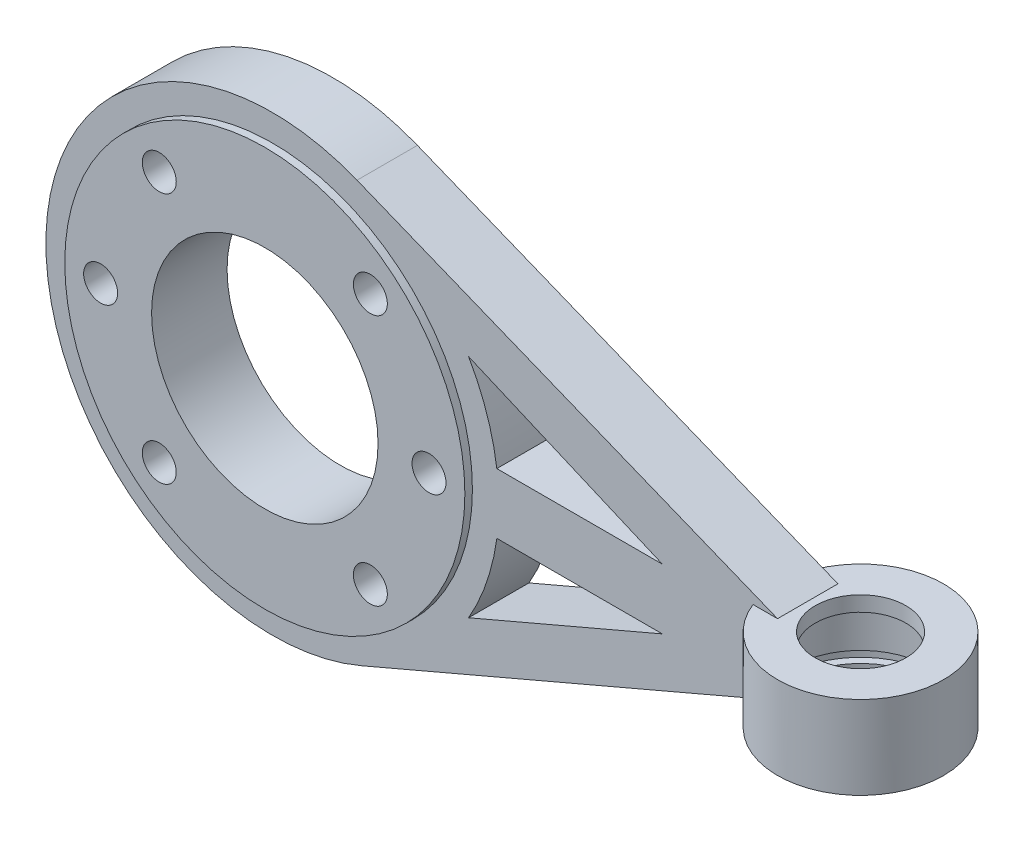
ISO-10303-21;
HEADER;
FILE_DESCRIPTION(('STEP AP214'),'2;1');
FILE_NAME('part.step','',(''),(''),'','','');
FILE_SCHEMA(('AUTOMOTIVE_DESIGN { 1 0 10303 214 1 1 1 1 }'));
ENDSEC;
DATA;
#1=APPLICATION_CONTEXT('core data for automotive mechanical design processes');
#2=APPLICATION_PROTOCOL_DEFINITION('international standard','automotive_design',2000,#1);
#3=PRODUCT_CONTEXT('',#1,'mechanical');
#4=PRODUCT('Part','Part','',(#3));
#5=PRODUCT_RELATED_PRODUCT_CATEGORY('part','',(#4));
#6=PRODUCT_DEFINITION_FORMATION('','',#4);
#7=PRODUCT_DEFINITION_CONTEXT('part definition',#1,'design');
#8=PRODUCT_DEFINITION('design','',#6,#7);
#9=PRODUCT_DEFINITION_SHAPE('','',#8);
#10=(LENGTH_UNIT() NAMED_UNIT(*) SI_UNIT(.MILLI.,.METRE.));
#11=(NAMED_UNIT(*) PLANE_ANGLE_UNIT() SI_UNIT($,.RADIAN.));
#12=(NAMED_UNIT(*) SI_UNIT($,.STERADIAN.) SOLID_ANGLE_UNIT());
#13=UNCERTAINTY_MEASURE_WITH_UNIT(LENGTH_MEASURE(1.E-05),#10,'distance_accuracy_value','');
#14=(GEOMETRIC_REPRESENTATION_CONTEXT(3) GLOBAL_UNCERTAINTY_ASSIGNED_CONTEXT((#13)) GLOBAL_UNIT_ASSIGNED_CONTEXT((#10,
#11,#12)) REPRESENTATION_CONTEXT('',''));
#15=CARTESIAN_POINT('',(0.,0.,0.));
#16=DIRECTION('',(0.,0.,1.));
#17=DIRECTION('',(1.,0.,0.));
#18=AXIS2_PLACEMENT_3D('',#15,#16,#17);
#19=CARTESIAN_POINT('',(73.9156216453703,30.8308441227157,3.));
#20=DIRECTION('',(0.,-1.,0.));
#21=DIRECTION('',(0.,0.,-1.));
#22=AXIS2_PLACEMENT_3D('',#19,#20,#21);
#23=CYLINDRICAL_SURFACE('',#22,9.);
#24=CARTESIAN_POINT('',(73.9156216453703,3.375,3.));
#25=DIRECTION('',(0.,1.,0.));
#26=DIRECTION('',(-1.,0.,0.));
#27=AXIS2_PLACEMENT_3D('',#24,#25,#26);
#28=CIRCLE('',#27,9.);
#29=CARTESIAN_POINT('',(64.9156216453703,3.375,3.));
#30=VERTEX_POINT('',#29);
#31=EDGE_CURVE('E181',#30,#30,#28,.F.);
#32=ORIENTED_EDGE('',*,*,#31,.F.);
#33=EDGE_LOOP('',(#32));
#34=FACE_BOUND('',#33,.T.);
#35=CARTESIAN_POINT('',(73.9156216453703,-3.12500000000002,3.));
#36=DIRECTION('',(0.,-1.,0.));
#37=DIRECTION('',(0.,0.,-1.));
#38=AXIS2_PLACEMENT_3D('',#35,#36,#37);
#39=CIRCLE('',#38,9.);
#40=CARTESIAN_POINT('',(73.9156216453703,-3.12500000000002,-6.));
#41=VERTEX_POINT('',#40);
#42=EDGE_CURVE('E166',#41,#41,#39,.T.);
#43=ORIENTED_EDGE('',*,*,#42,.T.);
#44=EDGE_LOOP('',(#43));
#45=FACE_BOUND('',#44,.T.);
#46=ADVANCED_FACE('F37',(#34,#45),#23,.F.);
#47=CARTESIAN_POINT('',(11.2147311143225,27.824985283616,7.));
#48=DIRECTION('',(-0.373824370477416,-0.927499509453867,0.));
#49=DIRECTION('',(0.927499509453867,-0.373824370477416,0.));
#50=AXIS2_PLACEMENT_3D('',#47,#48,#49);
#51=PLANE('',#50);
#52=DIRECTION('',(-0.927499509453867,0.373824370477416,0.));
#53=VECTOR('',#52,1.);
#54=CARTESIAN_POINT('',(11.2147311143225,27.824985283616,-1.));
#55=LINE('',#54,#53);
#56=CARTESIAN_POINT('',(66.9156216453703,5.375,-1.));
#57=VERTEX_POINT('',#56);
#58=CARTESIAN_POINT('',(11.2147311143225,27.824985283616,-1.));
#59=VERTEX_POINT('',#58);
#60=EDGE_CURVE('E200',#57,#59,#55,.T.);
#61=ORIENTED_EDGE('',*,*,#60,.T.);
#62=DIRECTION('',(0.,0.,-1.));
#63=VECTOR('',#62,1.);
#64=CARTESIAN_POINT('',(11.2147311143225,27.824985283616,7.));
#65=LINE('',#64,#63);
#66=CARTESIAN_POINT('',(11.2147311143225,27.824985283616,7.));
#67=VERTEX_POINT('',#66);
#68=EDGE_CURVE('E219',#67,#59,#65,.T.);
#69=ORIENTED_EDGE('',*,*,#68,.F.);
#70=DIRECTION('',(-0.927499509453867,0.373824370477416,0.));
#71=VECTOR('',#70,1.);
#72=CARTESIAN_POINT('',(11.2147311143225,27.824985283616,7.));
#73=LINE('',#72,#71);
#74=CARTESIAN_POINT('',(66.9156216453703,5.375,7.));
#75=VERTEX_POINT('',#74);
#76=EDGE_CURVE('E201',#75,#67,#73,.T.);
#77=ORIENTED_EDGE('',*,*,#76,.F.);
#78=DIRECTION('',(0.,0.,-1.));
#79=VECTOR('',#78,1.);
#80=CARTESIAN_POINT('',(66.9156216453703,5.375,7.));
#81=LINE('',#80,#79);
#82=EDGE_CURVE('E221',#75,#57,#81,.T.);
#83=ORIENTED_EDGE('',*,*,#82,.T.);
#84=EDGE_LOOP('',(#61,#69,#77,#83));
#85=FACE_BOUND('',#84,.T.);
#86=ADVANCED_FACE('F303',(#85),#51,.F.);
#87=CARTESIAN_POINT('',(11.8010452100285,-27.581430926456,7.));
#88=DIRECTION('',(-0.393368173667616,0.919381030881867,0.));
#89=DIRECTION('',(-0.919381030881867,-0.393368173667616,0.));
#90=AXIS2_PLACEMENT_3D('',#87,#88,#89);
#91=PLANE('',#90);
#92=DIRECTION('',(0.,0.,1.));
#93=VECTOR('',#92,1.);
#94=CARTESIAN_POINT('',(63.1176677813004,-5.62500000000001,7.));
#95=LINE('',#94,#93);
#96=CARTESIAN_POINT('',(63.1176677813004,-5.625,0.90138322950138));
#97=VERTEX_POINT('',#96);
#98=CARTESIAN_POINT('',(63.1176677813004,-5.625,5.09861677049862));
#99=VERTEX_POINT('',#98);
#100=EDGE_CURVE('E230',#97,#99,#95,.T.);
#101=ORIENTED_EDGE('',*,*,#100,.T.);
#102=CARTESIAN_POINT('',(73.9156216453703,-1.00496625100902,3.));
#103=DIRECTION('',(-0.393368173667616,0.919381030881867,0.));
#104=DIRECTION('',(0.919381030881867,0.393368173667616,0.));
#105=AXIS2_PLACEMENT_3D('',#102,#103,#104);
#106=ELLIPSE('',#105,11.9645714132788,11.);
#107=CARTESIAN_POINT('',(63.6686708794107,-5.38924673219444,7.));
#108=VERTEX_POINT('',#107);
#109=EDGE_CURVE('E196',#99,#108,#106,.T.);
#110=ORIENTED_EDGE('',*,*,#109,.T.);
#111=DIRECTION('',(0.919381030881867,0.393368173667616,0.));
#112=VECTOR('',#111,1.);
#113=CARTESIAN_POINT('',(11.8010452100285,-27.581430926456,7.));
#114=LINE('',#113,#112);
#115=CARTESIAN_POINT('',(11.8010452100285,-27.581430926456,7.));
#116=VERTEX_POINT('',#115);
#117=EDGE_CURVE('E207',#116,#108,#114,.T.);
#118=ORIENTED_EDGE('',*,*,#117,.F.);
#119=DIRECTION('',(0.,0.,-1.));
#120=VECTOR('',#119,1.);
#121=CARTESIAN_POINT('',(11.8010452100285,-27.581430926456,7.));
#122=LINE('',#121,#120);
#123=CARTESIAN_POINT('',(11.8010452100285,-27.581430926456,-1.));
#124=VERTEX_POINT('',#123);
#125=EDGE_CURVE('E210',#116,#124,#122,.T.);
#126=ORIENTED_EDGE('',*,*,#125,.T.);
#127=DIRECTION('',(0.919381030881867,0.393368173667616,0.));
#128=VECTOR('',#127,1.);
#129=CARTESIAN_POINT('',(11.8010452100285,-27.581430926456,-1.));
#130=LINE('',#129,#128);
#131=CARTESIAN_POINT('',(63.6686708794107,-5.38924673219444,-1.));
#132=VERTEX_POINT('',#131);
#133=EDGE_CURVE('E205',#124,#132,#130,.T.);
#134=ORIENTED_EDGE('',*,*,#133,.T.);
#135=EDGE_CURVE('E192',#132,#97,#106,.T.);
#136=ORIENTED_EDGE('',*,*,#135,.T.);
#137=EDGE_LOOP('',(#101,#110,#118,#126,#134,#136));
#138=FACE_BOUND('',#137,.T.);
#139=ADVANCED_FACE('F317',(#138),#91,.F.);
#140=CARTESIAN_POINT('',(0.,0.,7.));
#141=DIRECTION('',(0.,0.,1.));
#142=DIRECTION('',(1.,0.,0.));
#143=AXIS2_PLACEMENT_3D('',#140,#141,#142);
#144=PLANE('',#143);
#145=CARTESIAN_POINT('',(0.,0.,7.));
#146=DIRECTION('',(0.,0.,1.));
#147=DIRECTION('',(1.,0.,0.));
#148=AXIS2_PLACEMENT_3D('',#145,#146,#147);
#149=CIRCLE('',#148,30.);
#150=CARTESIAN_POINT('',(29.732137494637,-4.,7.));
#151=VERTEX_POINT('',#150);
#152=CARTESIAN_POINT('',(25.9896947238964,-14.9845176151477,7.));
#153=VERTEX_POINT('',#152);
#154=EDGE_CURVE('E155',#151,#153,#149,.F.);
#155=ORIENTED_EDGE('',*,*,#154,.F.);
#156=DIRECTION('',(-1.,0.,0.));
#157=VECTOR('',#156,1.);
#158=CARTESIAN_POINT('',(0.,-4.,7.));
#159=LINE('',#158,#157);
#160=CARTESIAN_POINT('',(51.6627354139849,-4.,7.));
#161=VERTEX_POINT('',#160);
#162=EDGE_CURVE('E153',#161,#151,#159,.T.);
#163=ORIENTED_EDGE('',*,*,#162,.F.);
#164=DIRECTION('',(0.919381030881867,0.393368173667616,0.));
#165=VECTOR('',#164,1.);
#166=CARTESIAN_POINT('',(9.44083616802279,-22.0651447411648,7.));
#167=LINE('',#166,#165);
#168=EDGE_CURVE('E148',#153,#161,#167,.T.);
#169=ORIENTED_EDGE('',*,*,#168,.F.);
#170=EDGE_LOOP('',(#155,#163,#169));
#171=FACE_BOUND('',#170,.T.);
#172=CARTESIAN_POINT('',(0.,0.,7.));
#173=DIRECTION('',(0.,0.,1.));
#174=DIRECTION('',(1.,0.,0.));
#175=AXIS2_PLACEMENT_3D('',#172,#173,#174);
#176=CIRCLE('',#175,30.);
#177=CARTESIAN_POINT('',(25.9896947238964,14.9845176151477,7.));
#178=VERTEX_POINT('',#177);
#179=CARTESIAN_POINT('',(29.732137494637,4.,7.));
#180=VERTEX_POINT('',#179);
#181=EDGE_CURVE('E146',#178,#180,#176,.F.);
#182=ORIENTED_EDGE('',*,*,#181,.F.);
#183=DIRECTION('',(-0.919381030881867,0.393368173667616,0.));
#184=VECTOR('',#183,1.);
#185=CARTESIAN_POINT('',(9.44083616802279,22.0651447411648,7.));
#186=LINE('',#185,#184);
#187=CARTESIAN_POINT('',(51.6627354139849,4.,7.));
#188=VERTEX_POINT('',#187);
#189=EDGE_CURVE('E132',#188,#178,#186,.T.);
#190=ORIENTED_EDGE('',*,*,#189,.F.);
#191=DIRECTION('',(1.,0.,0.));
#192=VECTOR('',#191,1.);
#193=CARTESIAN_POINT('',(0.,4.,7.));
#194=LINE('',#193,#192);
#195=EDGE_CURVE('E124',#180,#188,#194,.T.);
#196=ORIENTED_EDGE('',*,*,#195,.F.);
#197=EDGE_LOOP('',(#182,#190,#196));
#198=FACE_BOUND('',#197,.T.);
#199=CARTESIAN_POINT('',(0.,0.,7.));
#200=DIRECTION('',(0.,0.,1.));
#201=DIRECTION('',(1.,0.,0.));
#202=AXIS2_PLACEMENT_3D('',#199,#200,#201);
#203=CIRCLE('',#202,26.5);
#204=CARTESIAN_POINT('',(26.5,0.,7.));
#205=VERTEX_POINT('',#204);
#206=EDGE_CURVE('E161',#205,#205,#203,.F.);
#207=ORIENTED_EDGE('',*,*,#206,.T.);
#208=EDGE_LOOP('',(#207));
#209=FACE_BOUND('',#208,.T.);
#210=DIRECTION('',(-1.,0.,0.));
#211=VECTOR('',#210,1.);
#212=CARTESIAN_POINT('',(0.,5.37499999999998,7.));
#213=LINE('',#212,#211);
#214=CARTESIAN_POINT('',(63.6686708794107,5.375,7.));
#215=VERTEX_POINT('',#214);
#216=EDGE_CURVE('E198',#75,#215,#213,.T.);
#217=ORIENTED_EDGE('',*,*,#216,.F.);
#218=ORIENTED_EDGE('',*,*,#76,.T.);
#219=CARTESIAN_POINT('',(0.,0.,7.));
#220=DIRECTION('',(0.,0.,1.));
#221=DIRECTION('',(1.,0.,0.));
#222=AXIS2_PLACEMENT_3D('',#219,#220,#221);
#223=CIRCLE('',#222,30.);
#224=EDGE_CURVE('E204',#67,#116,#223,.T.);
#225=ORIENTED_EDGE('',*,*,#224,.T.);
#226=ORIENTED_EDGE('',*,*,#117,.T.);
#227=DIRECTION('',(0.,1.,0.));
#228=VECTOR('',#227,1.);
#229=CARTESIAN_POINT('',(63.6686708794107,22.7172907254557,7.));
#230=LINE('',#229,#228);
#231=EDGE_CURVE('E195',#215,#108,#230,.F.);
#232=ORIENTED_EDGE('',*,*,#231,.F.);
#233=EDGE_LOOP('',(#217,#218,#225,#226,#232));
#234=FACE_BOUND('',#233,.T.);
#235=ADVANCED_FACE('F144',(#171,#198,#209,#234),#144,.T.);
#236=CARTESIAN_POINT('',(0.,0.,-1.));
#237=DIRECTION('',(0.,0.,1.));
#238=DIRECTION('',(1.,0.,0.));
#239=AXIS2_PLACEMENT_3D('',#236,#237,#238);
#240=PLANE('',#239);
#241=DIRECTION('',(-1.,0.,0.));
#242=VECTOR('',#241,1.);
#243=CARTESIAN_POINT('',(0.,-4.,-1.));
#244=LINE('',#243,#242);
#245=CARTESIAN_POINT('',(51.6627354139849,-4.,-1.));
#246=VERTEX_POINT('',#245);
#247=CARTESIAN_POINT('',(29.732137494637,-4.,-1.));
#248=VERTEX_POINT('',#247);
#249=EDGE_CURVE('E45',#246,#248,#244,.T.);
#250=ORIENTED_EDGE('',*,*,#249,.T.);
#251=CARTESIAN_POINT('',(0.,0.,-1.));
#252=DIRECTION('',(0.,0.,1.));
#253=DIRECTION('',(1.,0.,0.));
#254=AXIS2_PLACEMENT_3D('',#251,#252,#253);
#255=CIRCLE('',#254,30.);
#256=CARTESIAN_POINT('',(25.9896947238964,-14.9845176151477,-1.));
#257=VERTEX_POINT('',#256);
#258=EDGE_CURVE('E12',#248,#257,#255,.F.);
#259=ORIENTED_EDGE('',*,*,#258,.T.);
#260=DIRECTION('',(0.919381030881867,0.393368173667616,0.));
#261=VECTOR('',#260,1.);
#262=CARTESIAN_POINT('',(9.44083616802279,-22.0651447411648,-1.));
#263=LINE('',#262,#261);
#264=EDGE_CURVE('E250',#257,#246,#263,.T.);
#265=ORIENTED_EDGE('',*,*,#264,.T.);
#266=EDGE_LOOP('',(#250,#259,#265));
#267=FACE_BOUND('',#266,.T.);
#268=DIRECTION('',(-0.919381030881867,0.393368173667616,0.));
#269=VECTOR('',#268,1.);
#270=CARTESIAN_POINT('',(9.44083616802279,22.0651447411648,-1.));
#271=LINE('',#270,#269);
#272=CARTESIAN_POINT('',(51.6627354139849,4.,-1.));
#273=VERTEX_POINT('',#272);
#274=CARTESIAN_POINT('',(25.9896947238964,14.9845176151477,-1.));
#275=VERTEX_POINT('',#274);
#276=EDGE_CURVE('E140',#273,#275,#271,.T.);
#277=ORIENTED_EDGE('',*,*,#276,.T.);
#278=CARTESIAN_POINT('',(0.,0.,-1.));
#279=DIRECTION('',(0.,0.,1.));
#280=DIRECTION('',(1.,0.,0.));
#281=AXIS2_PLACEMENT_3D('',#278,#279,#280);
#282=CIRCLE('',#281,30.);
#283=CARTESIAN_POINT('',(29.732137494637,4.,-1.));
#284=VERTEX_POINT('',#283);
#285=EDGE_CURVE('E247',#275,#284,#282,.F.);
#286=ORIENTED_EDGE('',*,*,#285,.T.);
#287=DIRECTION('',(1.,0.,0.));
#288=VECTOR('',#287,1.);
#289=CARTESIAN_POINT('',(0.,4.,-1.));
#290=LINE('',#289,#288);
#291=EDGE_CURVE('E240',#284,#273,#290,.T.);
#292=ORIENTED_EDGE('',*,*,#291,.T.);
#293=EDGE_LOOP('',(#277,#286,#292));
#294=FACE_BOUND('',#293,.T.);
#295=CARTESIAN_POINT('',(0.,0.,-1.));
#296=DIRECTION('',(0.,0.,1.));
#297=DIRECTION('',(1.,0.,0.));
#298=AXIS2_PLACEMENT_3D('',#295,#296,#297);
#299=CIRCLE('',#298,26.5);
#300=CARTESIAN_POINT('',(26.5,0.,-1.));
#301=VERTEX_POINT('',#300);
#302=EDGE_CURVE('E233',#301,#301,#299,.F.);
#303=ORIENTED_EDGE('',*,*,#302,.F.);
#304=EDGE_LOOP('',(#303));
#305=FACE_BOUND('',#304,.T.);
#306=ORIENTED_EDGE('',*,*,#60,.F.);
#307=DIRECTION('',(-1.,0.,0.));
#308=VECTOR('',#307,1.);
#309=CARTESIAN_POINT('',(0.,5.37499999999998,-1.));
#310=LINE('',#309,#308);
#311=CARTESIAN_POINT('',(63.6686708794107,5.375,-1.));
#312=VERTEX_POINT('',#311);
#313=EDGE_CURVE('E227',#57,#312,#310,.T.);
#314=ORIENTED_EDGE('',*,*,#313,.T.);
#315=DIRECTION('',(0.,1.,0.));
#316=VECTOR('',#315,1.);
#317=CARTESIAN_POINT('',(63.6686708794107,22.7172907254557,-1.));
#318=LINE('',#317,#316);
#319=EDGE_CURVE('E224',#312,#132,#318,.F.);
#320=ORIENTED_EDGE('',*,*,#319,.T.);
#321=ORIENTED_EDGE('',*,*,#133,.F.);
#322=CARTESIAN_POINT('',(0.,0.,-1.));
#323=DIRECTION('',(0.,0.,1.));
#324=DIRECTION('',(1.,0.,0.));
#325=AXIS2_PLACEMENT_3D('',#322,#323,#324);
#326=CIRCLE('',#325,30.);
#327=EDGE_CURVE('E213',#59,#124,#326,.T.);
#328=ORIENTED_EDGE('',*,*,#327,.F.);
#329=EDGE_LOOP('',(#306,#314,#320,#321,#328));
#330=FACE_BOUND('',#329,.T.);
#331=ADVANCED_FACE('F255',(#267,#294,#305,#330),#240,.F.);
#332=CARTESIAN_POINT('',(0.,0.,3.));
#333=DIRECTION('',(0.,0.,-1.));
#334=DIRECTION('',(-1.,0.,0.));
#335=AXIS2_PLACEMENT_3D('',#332,#333,#334);
#336=CYLINDRICAL_SURFACE('',#335,30.);
#337=ORIENTED_EDGE('',*,*,#327,.T.);
#338=ORIENTED_EDGE('',*,*,#125,.F.);
#339=ORIENTED_EDGE('',*,*,#224,.F.);
#340=ORIENTED_EDGE('',*,*,#68,.T.);
#341=EDGE_LOOP('',(#337,#338,#339,#340));
#342=FACE_BOUND('',#341,.T.);
#343=ADVANCED_FACE('F39',(#342),#336,.T.);
#344=CARTESIAN_POINT('',(62.9156216453703,-5.625,3.));
#345=DIRECTION('',(0.,-1.,0.));
#346=DIRECTION('',(1.,0.,0.));
#347=AXIS2_PLACEMENT_3D('',#344,#345,#346);
#348=PLANE('',#347);
#349=CARTESIAN_POINT('',(73.9156216453703,-5.62500000000002,3.));
#350=DIRECTION('',(0.,-1.,0.));
#351=DIRECTION('',(0.,0.,-1.));
#352=AXIS2_PLACEMENT_3D('',#349,#350,#351);
#353=CIRCLE('',#352,9.);
#354=CARTESIAN_POINT('',(73.9156216453703,-5.62500000000002,-6.));
#355=VERTEX_POINT('',#354);
#356=EDGE_CURVE('E174',#355,#355,#353,.T.);
#357=ORIENTED_EDGE('',*,*,#356,.F.);
#358=EDGE_LOOP('',(#357));
#359=FACE_BOUND('',#358,.T.);
#360=ORIENTED_EDGE('',*,*,#100,.F.);
#361=CARTESIAN_POINT('',(73.9156216453703,-5.625,3.));
#362=DIRECTION('',(0.,1.,0.));
#363=DIRECTION('',(-1.,0.,0.));
#364=AXIS2_PLACEMENT_3D('',#361,#362,#363);
#365=CIRCLE('',#364,11.);
#366=EDGE_CURVE('E185',#99,#97,#365,.T.);
#367=ORIENTED_EDGE('',*,*,#366,.F.);
#368=EDGE_LOOP('',(#360,#367));
#369=FACE_BOUND('',#368,.T.);
#370=ADVANCED_FACE('F319',(#359,#369),#348,.T.);
#371=CARTESIAN_POINT('',(73.9156216453703,22.7172907254557,3.));
#372=DIRECTION('',(0.,1.,0.));
#373=DIRECTION('',(-1.,0.,0.));
#374=AXIS2_PLACEMENT_3D('',#371,#372,#373);
#375=CYLINDRICAL_SURFACE('',#374,11.);
#376=ORIENTED_EDGE('',*,*,#109,.F.);
#377=ORIENTED_EDGE('',*,*,#366,.T.);
#378=ORIENTED_EDGE('',*,*,#135,.F.);
#379=ORIENTED_EDGE('',*,*,#319,.F.);
#380=CARTESIAN_POINT('',(73.9156216453703,5.375,3.));
#381=DIRECTION('',(0.,1.,0.));
#382=DIRECTION('',(-1.,0.,0.));
#383=AXIS2_PLACEMENT_3D('',#380,#381,#382);
#384=CIRCLE('',#383,11.);
#385=EDGE_CURVE('E188',#215,#312,#384,.T.);
#386=ORIENTED_EDGE('',*,*,#385,.F.);
#387=ORIENTED_EDGE('',*,*,#231,.T.);
#388=EDGE_LOOP('',(#376,#377,#378,#379,#386,#387));
#389=FACE_BOUND('',#388,.T.);
#390=ADVANCED_FACE('F314',(#389),#375,.T.);
#391=CARTESIAN_POINT('',(62.9156216453703,5.375,3.));
#392=DIRECTION('',(0.,1.,0.));
#393=DIRECTION('',(-1.,0.,0.));
#394=AXIS2_PLACEMENT_3D('',#391,#392,#393);
#395=PLANE('',#394);
#396=CARTESIAN_POINT('',(73.9156216453703,5.375,3.));
#397=DIRECTION('',(0.,1.,0.));
#398=DIRECTION('',(-1.,0.,0.));
#399=AXIS2_PLACEMENT_3D('',#396,#397,#398);
#400=CIRCLE('',#399,6.);
#401=CARTESIAN_POINT('',(67.9156216453703,5.375,3.));
#402=VERTEX_POINT('',#401);
#403=EDGE_CURVE('E189',#402,#402,#400,.T.);
#404=ORIENTED_EDGE('',*,*,#403,.F.);
#405=EDGE_LOOP('',(#404));
#406=FACE_BOUND('',#405,.T.);
#407=ORIENTED_EDGE('',*,*,#82,.F.);
#408=ORIENTED_EDGE('',*,*,#216,.T.);
#409=ORIENTED_EDGE('',*,*,#385,.T.);
#410=ORIENTED_EDGE('',*,*,#313,.F.);
#411=EDGE_LOOP('',(#407,#408,#409,#410));
#412=FACE_BOUND('',#411,.T.);
#413=ADVANCED_FACE('F306',(#406,#412),#395,.T.);
#414=CARTESIAN_POINT('',(73.9156216453703,19.375,3.));
#415=DIRECTION('',(0.,-1.,0.));
#416=DIRECTION('',(0.,0.,-1.));
#417=AXIS2_PLACEMENT_3D('',#414,#415,#416);
#418=CYLINDRICAL_SURFACE('',#417,6.);
#419=CARTESIAN_POINT('',(73.9156216453703,3.375,3.));
#420=DIRECTION('',(0.,1.,0.));
#421=DIRECTION('',(-1.,0.,0.));
#422=AXIS2_PLACEMENT_3D('',#419,#420,#421);
#423=CIRCLE('',#422,6.);
#424=CARTESIAN_POINT('',(67.9156216453703,3.375,3.));
#425=VERTEX_POINT('',#424);
#426=EDGE_CURVE('E184',#425,#425,#423,.F.);
#427=ORIENTED_EDGE('',*,*,#426,.T.);
#428=EDGE_LOOP('',(#427));
#429=FACE_BOUND('',#428,.T.);
#430=ORIENTED_EDGE('',*,*,#403,.T.);
#431=EDGE_LOOP('',(#430));
#432=FACE_BOUND('',#431,.T.);
#433=ADVANCED_FACE('F349',(#429,#432),#418,.F.);
#434=CARTESIAN_POINT('',(62.9156216453703,3.375,3.));
#435=DIRECTION('',(0.,1.,0.));
#436=DIRECTION('',(-1.,0.,0.));
#437=AXIS2_PLACEMENT_3D('',#434,#435,#436);
#438=PLANE('',#437);
#439=ORIENTED_EDGE('',*,*,#31,.T.);
#440=EDGE_LOOP('',(#439));
#441=FACE_BOUND('',#440,.T.);
#442=ORIENTED_EDGE('',*,*,#426,.F.);
#443=EDGE_LOOP('',(#442));
#444=FACE_BOUND('',#443,.T.);
#445=ADVANCED_FACE('F341',(#441,#444),#438,.F.);
#446=CARTESIAN_POINT('',(73.9156216453703,-4.62500000000002,3.));
#447=DIRECTION('',(0.,-1.,0.));
#448=DIRECTION('',(0.,0.,-1.));
#449=AXIS2_PLACEMENT_3D('',#446,#447,#448);
#450=CIRCLE('',#449,9.);
#451=CARTESIAN_POINT('',(73.9156216453703,-4.62500000000002,-6.));
#452=VERTEX_POINT('',#451);
#453=EDGE_CURVE('E167',#452,#452,#450,.T.);
#454=ORIENTED_EDGE('',*,*,#453,.F.);
#455=EDGE_LOOP('',(#454));
#456=FACE_BOUND('',#455,.T.);
#457=ORIENTED_EDGE('',*,*,#356,.T.);
#458=EDGE_LOOP('',(#457));
#459=FACE_BOUND('',#458,.T.);
#460=ADVANCED_FACE('F331',(#456,#459),#23,.F.);
#461=CARTESIAN_POINT('',(73.9156216453703,-4.62500000000002,3.));
#462=DIRECTION('',(0.,1.,0.));
#463=DIRECTION('',(0.,0.,1.));
#464=AXIS2_PLACEMENT_3D('',#461,#462,#463);
#465=CYLINDRICAL_SURFACE('',#464,9.99999999999999);
#466=CARTESIAN_POINT('',(73.9156216453703,-4.62500000000002,3.));
#467=DIRECTION('',(0.,-1.,0.));
#468=DIRECTION('',(0.,0.,-1.));
#469=AXIS2_PLACEMENT_3D('',#466,#467,#468);
#470=CIRCLE('',#469,9.99999999999999);
#471=CARTESIAN_POINT('',(73.9156216453703,-4.62500000000002,-6.99999999999999));
#472=VERTEX_POINT('',#471);
#473=EDGE_CURVE('E170',#472,#472,#470,.T.);
#474=ORIENTED_EDGE('',*,*,#473,.T.);
#475=EDGE_LOOP('',(#474));
#476=FACE_BOUND('',#475,.T.);
#477=CARTESIAN_POINT('',(73.9156216453703,-3.12500000000002,3.));
#478=DIRECTION('',(0.,-1.,0.));
#479=DIRECTION('',(0.,0.,-1.));
#480=AXIS2_PLACEMENT_3D('',#477,#478,#479);
#481=CIRCLE('',#480,9.99999999999999);
#482=CARTESIAN_POINT('',(73.9156216453703,-3.12500000000002,-6.99999999999999));
#483=VERTEX_POINT('',#482);
#484=EDGE_CURVE('E171',#483,#483,#481,.T.);
#485=ORIENTED_EDGE('',*,*,#484,.F.);
#486=EDGE_LOOP('',(#485));
#487=FACE_BOUND('',#486,.T.);
#488=ADVANCED_FACE('F340',(#476,#487),#465,.F.);
#489=CARTESIAN_POINT('',(0.,-4.62500000000002,0.));
#490=DIRECTION('',(0.,-1.,0.));
#491=DIRECTION('',(0.,0.,-1.));
#492=AXIS2_PLACEMENT_3D('',#489,#490,#491);
#493=PLANE('',#492);
#494=ORIENTED_EDGE('',*,*,#453,.T.);
#495=EDGE_LOOP('',(#494));
#496=FACE_BOUND('',#495,.T.);
#497=ORIENTED_EDGE('',*,*,#473,.F.);
#498=EDGE_LOOP('',(#497));
#499=FACE_BOUND('',#498,.T.);
#500=ADVANCED_FACE('F347',(#496,#499),#493,.F.);
#501=CARTESIAN_POINT('',(0.,-3.12500000000002,0.));
#502=DIRECTION('',(0.,-1.,0.));
#503=DIRECTION('',(0.,0.,-1.));
#504=AXIS2_PLACEMENT_3D('',#501,#502,#503);
#505=PLANE('',#504);
#506=ORIENTED_EDGE('',*,*,#42,.F.);
#507=EDGE_LOOP('',(#506));
#508=FACE_BOUND('',#507,.T.);
#509=ORIENTED_EDGE('',*,*,#484,.T.);
#510=EDGE_LOOP('',(#509));
#511=FACE_BOUND('',#510,.T.);
#512=ADVANCED_FACE('F284',(#508,#511),#505,.T.);
#513=CARTESIAN_POINT('',(0.,0.,-2.));
#514=DIRECTION('',(0.,0.,-1.));
#515=DIRECTION('',(-1.,0.,0.));
#516=AXIS2_PLACEMENT_3D('',#513,#514,#515);
#517=PLANE('',#516);
#518=CARTESIAN_POINT('',(21.75,0.,-2.));
#519=DIRECTION('',(0.,0.,-1.));
#520=DIRECTION('',(-1.,0.,0.));
#521=AXIS2_PLACEMENT_3D('',#518,#519,#520);
#522=CIRCLE('',#521,2.25);
#523=CARTESIAN_POINT('',(19.5,0.,-2.));
#524=VERTEX_POINT('',#523);
#525=EDGE_CURVE('E269',#524,#524,#522,.T.);
#526=ORIENTED_EDGE('',*,*,#525,.F.);
#527=EDGE_LOOP('',(#526));
#528=FACE_BOUND('',#527,.T.);
#529=CARTESIAN_POINT('',(-13.9806305106822,16.6614666378378,-2.));
#530=DIRECTION('',(0.,0.,-1.));
#531=DIRECTION('',(-1.,0.,0.));
#532=AXIS2_PLACEMENT_3D('',#529,#530,#531);
#533=CIRCLE('',#532,2.25);
#534=CARTESIAN_POINT('',(-16.2306305106822,16.6614666378378,-2.));
#535=VERTEX_POINT('',#534);
#536=EDGE_CURVE('E452',#535,#535,#533,.T.);
#537=ORIENTED_EDGE('',*,*,#536,.F.);
#538=EDGE_LOOP('',(#537));
#539=FACE_BOUND('',#538,.T.);
#540=CARTESIAN_POINT('',(13.9806305106822,-16.6614666378378,-2.));
#541=DIRECTION('',(0.,0.,-1.));
#542=DIRECTION('',(-1.,0.,0.));
#543=AXIS2_PLACEMENT_3D('',#540,#541,#542);
#544=CIRCLE('',#543,2.25);
#545=CARTESIAN_POINT('',(11.7306305106822,-16.6614666378378,-2.));
#546=VERTEX_POINT('',#545);
#547=EDGE_CURVE('E450',#546,#546,#544,.T.);
#548=ORIENTED_EDGE('',*,*,#547,.F.);
#549=EDGE_LOOP('',(#548));
#550=FACE_BOUND('',#549,.T.);
#551=CARTESIAN_POINT('',(-21.75,0.,-2.));
#552=DIRECTION('',(0.,0.,-1.));
#553=DIRECTION('',(-1.,0.,0.));
#554=AXIS2_PLACEMENT_3D('',#551,#552,#553);
#555=CIRCLE('',#554,2.25);
#556=CARTESIAN_POINT('',(-24.,0.,-2.));
#557=VERTEX_POINT('',#556);
#558=EDGE_CURVE('E447',#557,#557,#555,.T.);
#559=ORIENTED_EDGE('',*,*,#558,.F.);
#560=EDGE_LOOP('',(#559));
#561=FACE_BOUND('',#560,.T.);
#562=CARTESIAN_POINT('',(-13.9806305106822,-16.6614666378378,-2.));
#563=DIRECTION('',(0.,0.,-1.));
#564=DIRECTION('',(-1.,0.,0.));
#565=AXIS2_PLACEMENT_3D('',#562,#563,#564);
#566=CIRCLE('',#565,2.25);
#567=CARTESIAN_POINT('',(-16.2306305106822,-16.6614666378378,-2.));
#568=VERTEX_POINT('',#567);
#569=EDGE_CURVE('E428',#568,#568,#566,.T.);
#570=ORIENTED_EDGE('',*,*,#569,.F.);
#571=EDGE_LOOP('',(#570));
#572=FACE_BOUND('',#571,.T.);
#573=CARTESIAN_POINT('',(13.9806305106822,16.6614666378378,-2.));
#574=DIRECTION('',(0.,0.,-1.));
#575=DIRECTION('',(-1.,0.,0.));
#576=AXIS2_PLACEMENT_3D('',#573,#574,#575);
#577=CIRCLE('',#576,2.25);
#578=CARTESIAN_POINT('',(11.7306305106822,16.6614666378378,-2.));
#579=VERTEX_POINT('',#578);
#580=EDGE_CURVE('E424',#579,#579,#577,.T.);
#581=ORIENTED_EDGE('',*,*,#580,.F.);
#582=EDGE_LOOP('',(#581));
#583=FACE_BOUND('',#582,.T.);
#584=CARTESIAN_POINT('',(0.,0.,-2.));
#585=DIRECTION('',(0.,0.,-1.));
#586=DIRECTION('',(-1.,0.,0.));
#587=AXIS2_PLACEMENT_3D('',#584,#585,#586);
#588=CIRCLE('',#587,15.);
#589=CARTESIAN_POINT('',(-15.,0.,-2.));
#590=VERTEX_POINT('',#589);
#591=EDGE_CURVE('E133',#590,#590,#588,.T.);
#592=ORIENTED_EDGE('',*,*,#591,.F.);
#593=EDGE_LOOP('',(#592));
#594=FACE_BOUND('',#593,.T.);
#595=CARTESIAN_POINT('',(0.,0.,-2.));
#596=DIRECTION('',(0.,0.,-1.));
#597=DIRECTION('',(-1.,0.,0.));
#598=AXIS2_PLACEMENT_3D('',#595,#596,#597);
#599=CIRCLE('',#598,26.5);
#600=CARTESIAN_POINT('',(-26.5,0.,-2.));
#601=VERTEX_POINT('',#600);
#602=EDGE_CURVE('E158',#601,#601,#599,.T.);
#603=ORIENTED_EDGE('',*,*,#602,.T.);
#604=EDGE_LOOP('',(#603));
#605=FACE_BOUND('',#604,.T.);
#606=ADVANCED_FACE('F280',(#528,#539,#550,#561,#572,#583,#594,#605),#517,.T.);
#607=CARTESIAN_POINT('',(0.,0.,-2.));
#608=DIRECTION('',(0.,0.,1.));
#609=DIRECTION('',(1.,0.,0.));
#610=AXIS2_PLACEMENT_3D('',#607,#608,#609);
#611=CYLINDRICAL_SURFACE('',#610,26.5);
#612=ORIENTED_EDGE('',*,*,#602,.F.);
#613=EDGE_LOOP('',(#612));
#614=FACE_BOUND('',#613,.T.);
#615=ORIENTED_EDGE('',*,*,#302,.T.);
#616=EDGE_LOOP('',(#615));
#617=FACE_BOUND('',#616,.T.);
#618=ADVANCED_FACE('F283',(#614,#617),#611,.T.);
#619=ORIENTED_EDGE('',*,*,#206,.F.);
#620=EDGE_LOOP('',(#619));
#621=FACE_BOUND('',#620,.T.);
#622=CARTESIAN_POINT('',(0.,0.,8.));
#623=DIRECTION('',(0.,0.,-1.));
#624=DIRECTION('',(-1.,0.,0.));
#625=AXIS2_PLACEMENT_3D('',#622,#623,#624);
#626=CIRCLE('',#625,26.5);
#627=CARTESIAN_POINT('',(-26.5,0.,8.));
#628=VERTEX_POINT('',#627);
#629=EDGE_CURVE('E157',#628,#628,#626,.T.);
#630=ORIENTED_EDGE('',*,*,#629,.T.);
#631=EDGE_LOOP('',(#630));
#632=FACE_BOUND('',#631,.T.);
#633=ADVANCED_FACE('F291',(#621,#632),#611,.T.);
#634=CARTESIAN_POINT('',(0.,0.,8.));
#635=DIRECTION('',(0.,0.,-1.));
#636=DIRECTION('',(-1.,0.,0.));
#637=AXIS2_PLACEMENT_3D('',#634,#635,#636);
#638=PLANE('',#637);
#639=CARTESIAN_POINT('',(21.75,0.,8.));
#640=DIRECTION('',(0.,0.,1.));
#641=DIRECTION('',(1.,0.,0.));
#642=AXIS2_PLACEMENT_3D('',#639,#640,#641);
#643=CIRCLE('',#642,2.25);
#644=CARTESIAN_POINT('',(24.,0.,8.));
#645=VERTEX_POINT('',#644);
#646=EDGE_CURVE('E423',#645,#645,#643,.T.);
#647=ORIENTED_EDGE('',*,*,#646,.F.);
#648=EDGE_LOOP('',(#647));
#649=FACE_BOUND('',#648,.T.);
#650=CARTESIAN_POINT('',(-13.9806305106822,16.6614666378378,8.));
#651=DIRECTION('',(0.,0.,1.));
#652=DIRECTION('',(1.,0.,0.));
#653=AXIS2_PLACEMENT_3D('',#650,#651,#652);
#654=CIRCLE('',#653,2.25);
#655=CARTESIAN_POINT('',(-11.7306305106822,16.6614666378378,8.));
#656=VERTEX_POINT('',#655);
#657=EDGE_CURVE('E434',#656,#656,#654,.T.);
#658=ORIENTED_EDGE('',*,*,#657,.F.);
#659=EDGE_LOOP('',(#658));
#660=FACE_BOUND('',#659,.T.);
#661=CARTESIAN_POINT('',(13.9806305106822,-16.6614666378378,8.));
#662=DIRECTION('',(0.,0.,1.));
#663=DIRECTION('',(1.,0.,0.));
#664=AXIS2_PLACEMENT_3D('',#661,#662,#663);
#665=CIRCLE('',#664,2.25);
#666=CARTESIAN_POINT('',(16.2306305106822,-16.6614666378378,8.));
#667=VERTEX_POINT('',#666);
#668=EDGE_CURVE('E425',#667,#667,#665,.T.);
#669=ORIENTED_EDGE('',*,*,#668,.F.);
#670=EDGE_LOOP('',(#669));
#671=FACE_BOUND('',#670,.T.);
#672=CARTESIAN_POINT('',(-21.75,0.,8.));
#673=DIRECTION('',(0.,0.,1.));
#674=DIRECTION('',(-1.,0.,0.));
#675=AXIS2_PLACEMENT_3D('',#672,#673,#674);
#676=CIRCLE('',#675,2.25);
#677=CARTESIAN_POINT('',(-24.,0.,8.));
#678=VERTEX_POINT('',#677);
#679=EDGE_CURVE('E431',#678,#678,#676,.T.);
#680=ORIENTED_EDGE('',*,*,#679,.F.);
#681=EDGE_LOOP('',(#680));
#682=FACE_BOUND('',#681,.T.);
#683=CARTESIAN_POINT('',(-13.9806305106822,-16.6614666378378,8.));
#684=DIRECTION('',(0.,0.,1.));
#685=DIRECTION('',(-1.,0.,0.));
#686=AXIS2_PLACEMENT_3D('',#683,#684,#685);
#687=CIRCLE('',#686,2.25);
#688=CARTESIAN_POINT('',(-16.2306305106822,-16.6614666378378,8.));
#689=VERTEX_POINT('',#688);
#690=EDGE_CURVE('E438',#689,#689,#687,.T.);
#691=ORIENTED_EDGE('',*,*,#690,.F.);
#692=EDGE_LOOP('',(#691));
#693=FACE_BOUND('',#692,.T.);
#694=CARTESIAN_POINT('',(13.9806305106822,16.6614666378378,8.));
#695=DIRECTION('',(0.,0.,1.));
#696=DIRECTION('',(-1.,0.,0.));
#697=AXIS2_PLACEMENT_3D('',#694,#695,#696);
#698=CIRCLE('',#697,2.25);
#699=CARTESIAN_POINT('',(11.7306305106822,16.6614666378378,8.));
#700=VERTEX_POINT('',#699);
#701=EDGE_CURVE('E437',#700,#700,#698,.T.);
#702=ORIENTED_EDGE('',*,*,#701,.F.);
#703=EDGE_LOOP('',(#702));
#704=FACE_BOUND('',#703,.T.);
#705=CARTESIAN_POINT('',(0.,0.,8.));
#706=DIRECTION('',(0.,0.,-1.));
#707=DIRECTION('',(-1.,0.,0.));
#708=AXIS2_PLACEMENT_3D('',#705,#706,#707);
#709=CIRCLE('',#708,15.);
#710=CARTESIAN_POINT('',(-15.,0.,8.));
#711=VERTEX_POINT('',#710);
#712=EDGE_CURVE('E241',#711,#711,#709,.T.);
#713=ORIENTED_EDGE('',*,*,#712,.T.);
#714=EDGE_LOOP('',(#713));
#715=FACE_BOUND('',#714,.T.);
#716=ORIENTED_EDGE('',*,*,#629,.F.);
#717=EDGE_LOOP('',(#716));
#718=FACE_BOUND('',#717,.T.);
#719=ADVANCED_FACE('F370',(#649,#660,#671,#682,#693,#704,#715,#718),#638,.F.);
#720=CARTESIAN_POINT('',(0.,0.,-8.));
#721=DIRECTION('',(0.,0.,1.));
#722=DIRECTION('',(1.,0.,0.));
#723=AXIS2_PLACEMENT_3D('',#720,#721,#722);
#724=CYLINDRICAL_SURFACE('',#723,15.);
#725=ORIENTED_EDGE('',*,*,#591,.T.);
#726=EDGE_LOOP('',(#725));
#727=FACE_BOUND('',#726,.T.);
#728=ORIENTED_EDGE('',*,*,#712,.F.);
#729=EDGE_LOOP('',(#728));
#730=FACE_BOUND('',#729,.T.);
#731=ADVANCED_FACE('F277',(#727,#730),#724,.F.);
#732=CARTESIAN_POINT('',(0.,0.,-8.));
#733=DIRECTION('',(0.,0.,1.));
#734=DIRECTION('',(1.,0.,0.));
#735=AXIS2_PLACEMENT_3D('',#732,#733,#734);
#736=CYLINDRICAL_SURFACE('',#735,30.);
#737=ORIENTED_EDGE('',*,*,#181,.T.);
#738=DIRECTION('',(0.,0.,1.));
#739=VECTOR('',#738,1.);
#740=CARTESIAN_POINT('',(29.732137494637,4.,-8.));
#741=LINE('',#740,#739);
#742=EDGE_CURVE('E60',#284,#180,#741,.T.);
#743=ORIENTED_EDGE('',*,*,#742,.F.);
#744=ORIENTED_EDGE('',*,*,#285,.F.);
#745=DIRECTION('',(0.,0.,1.));
#746=VECTOR('',#745,1.);
#747=CARTESIAN_POINT('',(25.9896947238964,14.9845176151477,-8.));
#748=LINE('',#747,#746);
#749=EDGE_CURVE('E142',#275,#178,#748,.T.);
#750=ORIENTED_EDGE('',*,*,#749,.T.);
#751=EDGE_LOOP('',(#737,#743,#744,#750));
#752=FACE_BOUND('',#751,.T.);
#753=ADVANCED_FACE('F375',(#752),#736,.T.);
#754=CARTESIAN_POINT('',(25.9896947238964,14.9845176151477,-8.));
#755=DIRECTION('',(0.393368173667616,0.919381030881867,0.));
#756=DIRECTION('',(-0.919381030881867,0.393368173667616,0.));
#757=AXIS2_PLACEMENT_3D('',#754,#755,#756);
#758=PLANE('',#757);
#759=ORIENTED_EDGE('',*,*,#189,.T.);
#760=ORIENTED_EDGE('',*,*,#749,.F.);
#761=ORIENTED_EDGE('',*,*,#276,.F.);
#762=DIRECTION('',(0.,0.,1.));
#763=VECTOR('',#762,1.);
#764=CARTESIAN_POINT('',(51.6627354139849,4.,-8.));
#765=LINE('',#764,#763);
#766=EDGE_CURVE('E127',#273,#188,#765,.T.);
#767=ORIENTED_EDGE('',*,*,#766,.T.);
#768=EDGE_LOOP('',(#759,#760,#761,#767));
#769=FACE_BOUND('',#768,.T.);
#770=ADVANCED_FACE('F136',(#769),#758,.F.);
#771=CARTESIAN_POINT('',(29.732137494637,4.,-8.));
#772=DIRECTION('',(0.,-1.,0.));
#773=DIRECTION('',(0.,0.,-1.));
#774=AXIS2_PLACEMENT_3D('',#771,#772,#773);
#775=PLANE('',#774);
#776=ORIENTED_EDGE('',*,*,#195,.T.);
#777=ORIENTED_EDGE('',*,*,#766,.F.);
#778=ORIENTED_EDGE('',*,*,#291,.F.);
#779=ORIENTED_EDGE('',*,*,#742,.T.);
#780=EDGE_LOOP('',(#776,#777,#778,#779));
#781=FACE_BOUND('',#780,.T.);
#782=ADVANCED_FACE('F126',(#781),#775,.F.);
#783=CARTESIAN_POINT('',(0.,0.,-8.));
#784=DIRECTION('',(0.,0.,1.));
#785=DIRECTION('',(1.,0.,0.));
#786=AXIS2_PLACEMENT_3D('',#783,#784,#785);
#787=CYLINDRICAL_SURFACE('',#786,30.);
#788=ORIENTED_EDGE('',*,*,#154,.T.);
#789=DIRECTION('',(0.,0.,1.));
#790=VECTOR('',#789,1.);
#791=CARTESIAN_POINT('',(25.9896947238964,-14.9845176151477,-8.));
#792=LINE('',#791,#790);
#793=EDGE_CURVE('E52',#257,#153,#792,.T.);
#794=ORIENTED_EDGE('',*,*,#793,.F.);
#795=ORIENTED_EDGE('',*,*,#258,.F.);
#796=DIRECTION('',(0.,0.,1.));
#797=VECTOR('',#796,1.);
#798=CARTESIAN_POINT('',(29.732137494637,-4.,-8.));
#799=LINE('',#798,#797);
#800=EDGE_CURVE('E244',#248,#151,#799,.T.);
#801=ORIENTED_EDGE('',*,*,#800,.T.);
#802=EDGE_LOOP('',(#788,#794,#795,#801));
#803=FACE_BOUND('',#802,.T.);
#804=ADVANCED_FACE('F381',(#803),#787,.T.);
#805=CARTESIAN_POINT('',(29.732137494637,-4.,-8.));
#806=DIRECTION('',(0.,1.,0.));
#807=DIRECTION('',(0.,0.,1.));
#808=AXIS2_PLACEMENT_3D('',#805,#806,#807);
#809=PLANE('',#808);
#810=ORIENTED_EDGE('',*,*,#162,.T.);
#811=ORIENTED_EDGE('',*,*,#800,.F.);
#812=ORIENTED_EDGE('',*,*,#249,.F.);
#813=DIRECTION('',(0.,0.,1.));
#814=VECTOR('',#813,1.);
#815=CARTESIAN_POINT('',(51.6627354139849,-4.,-8.));
#816=LINE('',#815,#814);
#817=EDGE_CURVE('E261',#246,#161,#816,.T.);
#818=ORIENTED_EDGE('',*,*,#817,.T.);
#819=EDGE_LOOP('',(#810,#811,#812,#818));
#820=FACE_BOUND('',#819,.T.);
#821=ADVANCED_FACE('F260',(#820),#809,.F.);
#822=CARTESIAN_POINT('',(25.9896947238964,-14.9845176151477,-8.));
#823=DIRECTION('',(0.393368173667616,-0.919381030881867,0.));
#824=DIRECTION('',(0.919381030881867,0.393368173667616,0.));
#825=AXIS2_PLACEMENT_3D('',#822,#823,#824);
#826=PLANE('',#825);
#827=ORIENTED_EDGE('',*,*,#168,.T.);
#828=ORIENTED_EDGE('',*,*,#817,.F.);
#829=ORIENTED_EDGE('',*,*,#264,.F.);
#830=ORIENTED_EDGE('',*,*,#793,.T.);
#831=EDGE_LOOP('',(#827,#828,#829,#830));
#832=FACE_BOUND('',#831,.T.);
#833=ADVANCED_FACE('F386',(#832),#826,.F.);
#834=CARTESIAN_POINT('',(13.9806305106822,16.6614666378378,-9.));
#835=DIRECTION('',(0.,0.,1.));
#836=DIRECTION('',(1.,0.,0.));
#837=AXIS2_PLACEMENT_3D('',#834,#835,#836);
#838=CYLINDRICAL_SURFACE('',#837,2.25);
#839=ORIENTED_EDGE('',*,*,#580,.T.);
#840=EDGE_LOOP('',(#839));
#841=FACE_BOUND('',#840,.T.);
#842=ORIENTED_EDGE('',*,*,#701,.T.);
#843=EDGE_LOOP('',(#842));
#844=FACE_BOUND('',#843,.T.);
#845=ADVANCED_FACE('F389',(#841,#844),#838,.F.);
#846=CARTESIAN_POINT('',(-13.9806305106822,-16.6614666378378,-9.));
#847=DIRECTION('',(0.,0.,1.));
#848=DIRECTION('',(1.,0.,0.));
#849=AXIS2_PLACEMENT_3D('',#846,#847,#848);
#850=CYLINDRICAL_SURFACE('',#849,2.25);
#851=ORIENTED_EDGE('',*,*,#569,.T.);
#852=EDGE_LOOP('',(#851));
#853=FACE_BOUND('',#852,.T.);
#854=ORIENTED_EDGE('',*,*,#690,.T.);
#855=EDGE_LOOP('',(#854));
#856=FACE_BOUND('',#855,.T.);
#857=ADVANCED_FACE('F398',(#853,#856),#850,.F.);
#858=CARTESIAN_POINT('',(-21.75,0.,-9.));
#859=DIRECTION('',(0.,0.,1.));
#860=DIRECTION('',(1.,0.,0.));
#861=AXIS2_PLACEMENT_3D('',#858,#859,#860);
#862=CYLINDRICAL_SURFACE('',#861,2.25);
#863=ORIENTED_EDGE('',*,*,#558,.T.);
#864=EDGE_LOOP('',(#863));
#865=FACE_BOUND('',#864,.T.);
#866=ORIENTED_EDGE('',*,*,#679,.T.);
#867=EDGE_LOOP('',(#866));
#868=FACE_BOUND('',#867,.T.);
#869=ADVANCED_FACE('F394',(#865,#868),#862,.F.);
#870=CARTESIAN_POINT('',(13.9806305106822,-16.6614666378378,-9.));
#871=DIRECTION('',(0.,0.,1.));
#872=DIRECTION('',(1.,0.,0.));
#873=AXIS2_PLACEMENT_3D('',#870,#871,#872);
#874=CYLINDRICAL_SURFACE('',#873,2.25);
#875=ORIENTED_EDGE('',*,*,#547,.T.);
#876=EDGE_LOOP('',(#875));
#877=FACE_BOUND('',#876,.T.);
#878=ORIENTED_EDGE('',*,*,#668,.T.);
#879=EDGE_LOOP('',(#878));
#880=FACE_BOUND('',#879,.T.);
#881=ADVANCED_FACE('F397',(#877,#880),#874,.F.);
#882=CARTESIAN_POINT('',(-13.9806305106822,16.6614666378378,-9.));
#883=DIRECTION('',(0.,0.,1.));
#884=DIRECTION('',(1.,0.,0.));
#885=AXIS2_PLACEMENT_3D('',#882,#883,#884);
#886=CYLINDRICAL_SURFACE('',#885,2.25);
#887=ORIENTED_EDGE('',*,*,#536,.T.);
#888=EDGE_LOOP('',(#887));
#889=FACE_BOUND('',#888,.T.);
#890=ORIENTED_EDGE('',*,*,#657,.T.);
#891=EDGE_LOOP('',(#890));
#892=FACE_BOUND('',#891,.T.);
#893=ADVANCED_FACE('F402',(#889,#892),#886,.F.);
#894=CARTESIAN_POINT('',(21.75,0.,-9.));
#895=DIRECTION('',(0.,0.,1.));
#896=DIRECTION('',(1.,0.,0.));
#897=AXIS2_PLACEMENT_3D('',#894,#895,#896);
#898=CYLINDRICAL_SURFACE('',#897,2.25);
#899=ORIENTED_EDGE('',*,*,#525,.T.);
#900=EDGE_LOOP('',(#899));
#901=FACE_BOUND('',#900,.T.);
#902=ORIENTED_EDGE('',*,*,#646,.T.);
#903=EDGE_LOOP('',(#902));
#904=FACE_BOUND('',#903,.T.);
#905=ADVANCED_FACE('F412',(#901,#904),#898,.F.);
#906=CLOSED_SHELL('',(#46,#86,#139,#235,#331,#343,#370,#390,#413,#433,#445,#460,#488,#500,#512,
#606,#618,#633,#719,#731,#753,#770,#782,#804,#821,#833,#845,#857,#869,#881,#893,#905));
#907=MANIFOLD_SOLID_BREP('B2',#906);
#908=ADVANCED_BREP_SHAPE_REPRESENTATION('',(#18,#907),#14);
#909=SHAPE_DEFINITION_REPRESENTATION(#9,#908);
ENDSEC;
END-ISO-10303-21;
